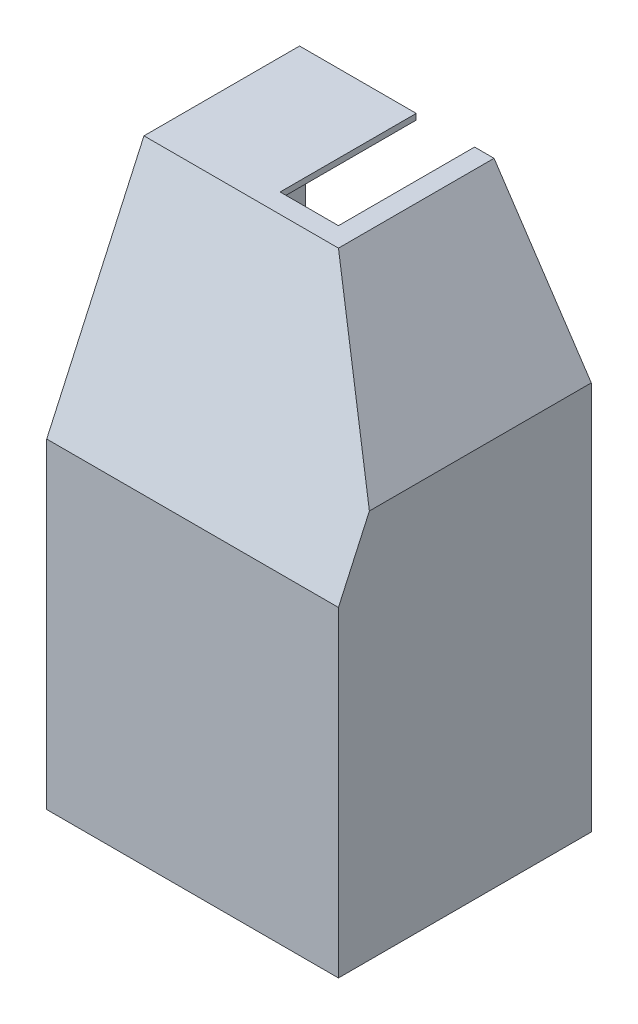
ISO-10303-21;
HEADER;
FILE_DESCRIPTION(('STEP AP214'),'2;1');
FILE_NAME('part.step','',(''),(''),'','','');
FILE_SCHEMA(('AUTOMOTIVE_DESIGN { 1 0 10303 214 1 1 1 1 }'));
ENDSEC;
DATA;
#1=APPLICATION_CONTEXT('core data for automotive mechanical design processes');
#2=APPLICATION_PROTOCOL_DEFINITION('international standard','automotive_design',2000,#1);
#3=PRODUCT_CONTEXT('',#1,'mechanical');
#4=PRODUCT('Part','Part','',(#3));
#5=PRODUCT_RELATED_PRODUCT_CATEGORY('part','',(#4));
#6=PRODUCT_DEFINITION_FORMATION('','',#4);
#7=PRODUCT_DEFINITION_CONTEXT('part definition',#1,'design');
#8=PRODUCT_DEFINITION('design','',#6,#7);
#9=PRODUCT_DEFINITION_SHAPE('','',#8);
#10=(LENGTH_UNIT() NAMED_UNIT(*) SI_UNIT(.MILLI.,.METRE.));
#11=(NAMED_UNIT(*) PLANE_ANGLE_UNIT() SI_UNIT($,.RADIAN.));
#12=(NAMED_UNIT(*) SI_UNIT($,.STERADIAN.) SOLID_ANGLE_UNIT());
#13=UNCERTAINTY_MEASURE_WITH_UNIT(LENGTH_MEASURE(1.E-05),#10,'distance_accuracy_value','');
#14=(GEOMETRIC_REPRESENTATION_CONTEXT(3) GLOBAL_UNCERTAINTY_ASSIGNED_CONTEXT((#13)) GLOBAL_UNIT_ASSIGNED_CONTEXT((#10,
#11,#12)) REPRESENTATION_CONTEXT('',''));
#15=CARTESIAN_POINT('',(0.,0.,0.));
#16=DIRECTION('',(0.,0.,1.));
#17=DIRECTION('',(1.,0.,0.));
#18=AXIS2_PLACEMENT_3D('',#15,#16,#17);
#19=CARTESIAN_POINT('',(75.,5.,130.));
#20=DIRECTION('',(-1.,0.,0.));
#21=DIRECTION('',(0.,0.,1.));
#22=AXIS2_PLACEMENT_3D('',#19,#20,#21);
#23=PLANE('',#22);
#24=DIRECTION('',(0.,0.,-1.));
#25=VECTOR('',#24,1.);
#26=CARTESIAN_POINT('',(75.,205.,130.));
#27=LINE('',#26,#25);
#28=CARTESIAN_POINT('',(75.,205.,114.090909090909));
#29=VERTEX_POINT('',#28);
#30=CARTESIAN_POINT('',(75.,205.,0.));
#31=VERTEX_POINT('',#30);
#32=EDGE_CURVE('E221',#29,#31,#27,.T.);
#33=ORIENTED_EDGE('',*,*,#32,.F.);
#34=DIRECTION('',(0.,-0.910366477462606,0.413802944301182));
#35=VECTOR('',#34,1.);
#36=CARTESIAN_POINT('',(75.,169.999999999999,130.));
#37=LINE('',#36,#35);
#38=CARTESIAN_POINT('',(75.,169.999999999999,130.));
#39=VERTEX_POINT('',#38);
#40=EDGE_CURVE('E11',#29,#39,#37,.T.);
#41=ORIENTED_EDGE('',*,*,#40,.T.);
#42=DIRECTION('',(0.,1.,0.));
#43=VECTOR('',#42,1.);
#44=CARTESIAN_POINT('',(75.,5.,130.));
#45=LINE('',#44,#43);
#46=CARTESIAN_POINT('',(75.,5.,130.));
#47=VERTEX_POINT('',#46);
#48=EDGE_CURVE('E189',#47,#39,#45,.T.);
#49=ORIENTED_EDGE('',*,*,#48,.F.);
#50=DIRECTION('',(0.,0.,-1.));
#51=VECTOR('',#50,1.);
#52=CARTESIAN_POINT('',(75.,5.,130.));
#53=LINE('',#52,#51);
#54=CARTESIAN_POINT('',(75.,5.,0.));
#55=VERTEX_POINT('',#54);
#56=EDGE_CURVE('E197',#47,#55,#53,.T.);
#57=ORIENTED_EDGE('',*,*,#56,.T.);
#58=DIRECTION('',(0.,1.,0.));
#59=VECTOR('',#58,1.);
#60=CARTESIAN_POINT('',(75.,5.,0.));
#61=LINE('',#60,#59);
#62=EDGE_CURVE('E198',#55,#31,#61,.T.);
#63=ORIENTED_EDGE('',*,*,#62,.T.);
#64=EDGE_LOOP('',(#33,#41,#49,#57,#63));
#65=FACE_BOUND('',#64,.T.);
#66=ADVANCED_FACE('F41',(#65),#23,.F.);
#67=CARTESIAN_POINT('',(75.,205.,130.));
#68=DIRECTION('',(-0.832050294337844,-0.554700196225229,0.));
#69=DIRECTION('',(0.554700196225229,-0.832050294337844,0.));
#70=AXIS2_PLACEMENT_3D('',#67,#68,#69);
#71=PLANE('',#70);
#72=DIRECTION('',(0.,0.,-1.));
#73=VECTOR('',#72,1.);
#74=CARTESIAN_POINT('',(24.9999999999999,280.,130.));
#75=LINE('',#74,#73);
#76=CARTESIAN_POINT('',(24.9999999999999,280.,79.9999999999999));
#77=VERTEX_POINT('',#76);
#78=CARTESIAN_POINT('',(24.9999999999999,280.,0.));
#79=VERTEX_POINT('',#78);
#80=EDGE_CURVE('E219',#77,#79,#75,.T.);
#81=ORIENTED_EDGE('',*,*,#80,.F.);
#82=DIRECTION('',(0.518833293700236,-0.778249940550355,0.353749972977432));
#83=VECTOR('',#82,1.);
#84=CARTESIAN_POINT('',(71.8631813125698,209.705228031145,111.952169076752));
#85=LINE('',#84,#83);
#86=EDGE_CURVE('E50',#77,#29,#85,.T.);
#87=ORIENTED_EDGE('',*,*,#86,.T.);
#88=ORIENTED_EDGE('',*,*,#32,.T.);
#89=DIRECTION('',(-0.554700196225229,0.832050294337844,0.));
#90=VECTOR('',#89,1.);
#91=CARTESIAN_POINT('',(75.,205.,0.));
#92=LINE('',#91,#90);
#93=EDGE_CURVE('E201',#31,#79,#92,.T.);
#94=ORIENTED_EDGE('',*,*,#93,.T.);
#95=EDGE_LOOP('',(#81,#87,#88,#94));
#96=FACE_BOUND('',#95,.T.);
#97=ADVANCED_FACE('F233',(#96),#71,.F.);
#98=CARTESIAN_POINT('',(24.9999999999999,280.,130.));
#99=DIRECTION('',(0.,-1.,0.));
#100=DIRECTION('',(0.,0.,-1.));
#101=AXIS2_PLACEMENT_3D('',#98,#99,#100);
#102=PLANE('',#101);
#103=DIRECTION('',(-1.,0.,0.));
#104=VECTOR('',#103,1.);
#105=CARTESIAN_POINT('',(24.9999999999999,280.,0.));
#106=LINE('',#105,#104);
#107=CARTESIAN_POINT('',(14.9999999999999,280.,0.));
#108=VERTEX_POINT('',#107);
#109=EDGE_CURVE('E205',#79,#108,#106,.T.);
#110=ORIENTED_EDGE('',*,*,#109,.T.);
#111=DIRECTION('',(0.,0.,-1.));
#112=VECTOR('',#111,1.);
#113=CARTESIAN_POINT('',(14.9999999999999,280.,0.));
#114=LINE('',#113,#112);
#115=CARTESIAN_POINT('',(14.9999999999999,280.,70.));
#116=VERTEX_POINT('',#115);
#117=EDGE_CURVE('E163',#116,#108,#114,.T.);
#118=ORIENTED_EDGE('',*,*,#117,.F.);
#119=DIRECTION('',(1.,0.,0.));
#120=VECTOR('',#119,1.);
#121=CARTESIAN_POINT('',(14.9999999999999,280.,70.));
#122=LINE('',#121,#120);
#123=CARTESIAN_POINT('',(-15.0000000000001,280.,70.));
#124=VERTEX_POINT('',#123);
#125=EDGE_CURVE('E263',#124,#116,#122,.T.);
#126=ORIENTED_EDGE('',*,*,#125,.F.);
#127=DIRECTION('',(0.,0.,1.));
#128=VECTOR('',#127,1.);
#129=CARTESIAN_POINT('',(-15.0000000000001,280.,70.));
#130=LINE('',#129,#128);
#131=CARTESIAN_POINT('',(-15.,280.,0.));
#132=VERTEX_POINT('',#131);
#133=EDGE_CURVE('E261',#132,#124,#130,.T.);
#134=ORIENTED_EDGE('',*,*,#133,.F.);
#135=CARTESIAN_POINT('',(-75.0000000000001,280.,0.));
#136=VERTEX_POINT('',#135);
#137=EDGE_CURVE('E172',#132,#136,#106,.T.);
#138=ORIENTED_EDGE('',*,*,#137,.T.);
#139=DIRECTION('',(0.,0.,-1.));
#140=VECTOR('',#139,1.);
#141=CARTESIAN_POINT('',(-75.0000000000001,280.,130.));
#142=LINE('',#141,#140);
#143=CARTESIAN_POINT('',(-75.0000000000001,280.,79.9999999999999));
#144=VERTEX_POINT('',#143);
#145=EDGE_CURVE('E216',#144,#136,#142,.T.);
#146=ORIENTED_EDGE('',*,*,#145,.F.);
#147=DIRECTION('',(1.,0.,0.));
#148=VECTOR('',#147,1.);
#149=CARTESIAN_POINT('',(24.9999999999999,280.,79.9999999999999));
#150=LINE('',#149,#148);
#151=EDGE_CURVE('E228',#144,#77,#150,.T.);
#152=ORIENTED_EDGE('',*,*,#151,.T.);
#153=ORIENTED_EDGE('',*,*,#80,.T.);
#154=EDGE_LOOP('',(#110,#118,#126,#134,#138,#146,#152,#153));
#155=FACE_BOUND('',#154,.T.);
#156=ADVANCED_FACE('F259',(#155),#102,.F.);
#157=CARTESIAN_POINT('',(-75.0000000000001,280.,130.));
#158=DIRECTION('',(1.,0.,0.));
#159=DIRECTION('',(0.,1.,0.));
#160=AXIS2_PLACEMENT_3D('',#157,#158,#159);
#161=PLANE('',#160);
#162=DIRECTION('',(0.,-1.,0.));
#163=VECTOR('',#162,1.);
#164=CARTESIAN_POINT('',(-75.0000000000001,280.,130.));
#165=LINE('',#164,#163);
#166=CARTESIAN_POINT('',(-75.0000000000001,169.999999999999,130.));
#167=VERTEX_POINT('',#166);
#168=CARTESIAN_POINT('',(-75.,5.,130.));
#169=VERTEX_POINT('',#168);
#170=EDGE_CURVE('E192',#167,#169,#165,.T.);
#171=ORIENTED_EDGE('',*,*,#170,.F.);
#172=DIRECTION('',(0.,0.910366477462606,-0.413802944301182));
#173=VECTOR('',#172,1.);
#174=CARTESIAN_POINT('',(-75.0000000000001,169.999999999999,130.));
#175=LINE('',#174,#173);
#176=EDGE_CURVE('E226',#167,#144,#175,.T.);
#177=ORIENTED_EDGE('',*,*,#176,.T.);
#178=ORIENTED_EDGE('',*,*,#145,.T.);
#179=DIRECTION('',(0.,-1.,0.));
#180=VECTOR('',#179,1.);
#181=CARTESIAN_POINT('',(-75.0000000000001,280.,0.));
#182=LINE('',#181,#180);
#183=CARTESIAN_POINT('',(-75.,5.,0.));
#184=VERTEX_POINT('',#183);
#185=EDGE_CURVE('E208',#136,#184,#182,.T.);
#186=ORIENTED_EDGE('',*,*,#185,.T.);
#187=DIRECTION('',(0.,0.,-1.));
#188=VECTOR('',#187,1.);
#189=CARTESIAN_POINT('',(-75.,5.,130.));
#190=LINE('',#189,#188);
#191=EDGE_CURVE('E213',#169,#184,#190,.T.);
#192=ORIENTED_EDGE('',*,*,#191,.F.);
#193=EDGE_LOOP('',(#171,#177,#178,#186,#192));
#194=FACE_BOUND('',#193,.T.);
#195=ADVANCED_FACE('F247',(#194),#161,.F.);
#196=CARTESIAN_POINT('',(-75.,5.,130.));
#197=DIRECTION('',(0.,1.,0.));
#198=DIRECTION('',(-1.,0.,0.));
#199=AXIS2_PLACEMENT_3D('',#196,#197,#198);
#200=PLANE('',#199);
#201=DIRECTION('',(1.,0.,0.));
#202=VECTOR('',#201,1.);
#203=CARTESIAN_POINT('',(-75.,5.,0.));
#204=LINE('',#203,#202);
#205=EDGE_CURVE('E193',#184,#55,#204,.T.);
#206=ORIENTED_EDGE('',*,*,#205,.T.);
#207=ORIENTED_EDGE('',*,*,#56,.F.);
#208=DIRECTION('',(1.,0.,0.));
#209=VECTOR('',#208,1.);
#210=CARTESIAN_POINT('',(-75.,5.,130.));
#211=LINE('',#210,#209);
#212=EDGE_CURVE('E195',#169,#47,#211,.T.);
#213=ORIENTED_EDGE('',*,*,#212,.F.);
#214=ORIENTED_EDGE('',*,*,#191,.T.);
#215=EDGE_LOOP('',(#206,#207,#213,#214));
#216=FACE_BOUND('',#215,.T.);
#217=ADVANCED_FACE('F253',(#216),#200,.F.);
#218=CARTESIAN_POINT('',(0.,0.,130.));
#219=DIRECTION('',(0.,0.,1.));
#220=DIRECTION('',(1.,0.,0.));
#221=AXIS2_PLACEMENT_3D('',#218,#219,#220);
#222=PLANE('',#221);
#223=ORIENTED_EDGE('',*,*,#48,.T.);
#224=DIRECTION('',(-1.,0.,0.));
#225=VECTOR('',#224,1.);
#226=CARTESIAN_POINT('',(-75.0000000000001,169.999999999999,130.));
#227=LINE('',#226,#225);
#228=EDGE_CURVE('E223',#39,#167,#227,.T.);
#229=ORIENTED_EDGE('',*,*,#228,.T.);
#230=ORIENTED_EDGE('',*,*,#170,.T.);
#231=ORIENTED_EDGE('',*,*,#212,.T.);
#232=EDGE_LOOP('',(#223,#229,#230,#231));
#233=FACE_BOUND('',#232,.T.);
#234=ADVANCED_FACE('F244',(#233),#222,.T.);
#235=CARTESIAN_POINT('',(0.,0.,0.));
#236=DIRECTION('',(0.,0.,1.));
#237=DIRECTION('',(1.,0.,0.));
#238=AXIS2_PLACEMENT_3D('',#235,#236,#237);
#239=PLANE('',#238);
#240=DIRECTION('',(-1.,0.,0.));
#241=VECTOR('',#240,1.);
#242=CARTESIAN_POINT('',(24.9999999999999,277.,0.));
#243=LINE('',#242,#241);
#244=CARTESIAN_POINT('',(23.3944487245359,277.,0.));
#245=VERTEX_POINT('',#244);
#246=CARTESIAN_POINT('',(14.9999999999999,277.,0.));
#247=VERTEX_POINT('',#246);
#248=EDGE_CURVE('E65',#245,#247,#243,.T.);
#249=ORIENTED_EDGE('',*,*,#248,.T.);
#250=DIRECTION('',(0.,1.,0.));
#251=VECTOR('',#250,1.);
#252=CARTESIAN_POINT('',(14.9999999999999,277.,0.));
#253=LINE('',#252,#251);
#254=EDGE_CURVE('E256',#247,#108,#253,.T.);
#255=ORIENTED_EDGE('',*,*,#254,.T.);
#256=ORIENTED_EDGE('',*,*,#109,.F.);
#257=ORIENTED_EDGE('',*,*,#93,.F.);
#258=ORIENTED_EDGE('',*,*,#62,.F.);
#259=ORIENTED_EDGE('',*,*,#205,.F.);
#260=ORIENTED_EDGE('',*,*,#185,.F.);
#261=ORIENTED_EDGE('',*,*,#137,.F.);
#262=DIRECTION('',(0.,1.,0.));
#263=VECTOR('',#262,1.);
#264=CARTESIAN_POINT('',(-15.,277.,0.));
#265=LINE('',#264,#263);
#266=CARTESIAN_POINT('',(-15.,277.,0.));
#267=VERTEX_POINT('',#266);
#268=EDGE_CURVE('E159',#267,#132,#265,.T.);
#269=ORIENTED_EDGE('',*,*,#268,.F.);
#270=CARTESIAN_POINT('',(-72.0000000000001,277.,0.));
#271=VERTEX_POINT('',#270);
#272=EDGE_CURVE('E169',#267,#271,#243,.T.);
#273=ORIENTED_EDGE('',*,*,#272,.T.);
#274=DIRECTION('',(0.,-1.,0.));
#275=VECTOR('',#274,1.);
#276=CARTESIAN_POINT('',(-72.0000000000001,280.,0.));
#277=LINE('',#276,#275);
#278=CARTESIAN_POINT('',(-72.,8.,0.));
#279=VERTEX_POINT('',#278);
#280=EDGE_CURVE('E182',#271,#279,#277,.T.);
#281=ORIENTED_EDGE('',*,*,#280,.T.);
#282=DIRECTION('',(1.,0.,0.));
#283=VECTOR('',#282,1.);
#284=CARTESIAN_POINT('',(-75.,8.,0.));
#285=LINE('',#284,#283);
#286=CARTESIAN_POINT('',(72.,8.,0.));
#287=VERTEX_POINT('',#286);
#288=EDGE_CURVE('E284',#279,#287,#285,.T.);
#289=ORIENTED_EDGE('',*,*,#288,.T.);
#290=DIRECTION('',(0.,1.,0.));
#291=VECTOR('',#290,1.);
#292=CARTESIAN_POINT('',(72.,5.,0.));
#293=LINE('',#292,#291);
#294=CARTESIAN_POINT('',(72.,204.091673086804,0.));
#295=VERTEX_POINT('',#294);
#296=EDGE_CURVE('E184',#287,#295,#293,.T.);
#297=ORIENTED_EDGE('',*,*,#296,.T.);
#298=DIRECTION('',(-0.554700196225229,0.832050294337844,0.));
#299=VECTOR('',#298,1.);
#300=CARTESIAN_POINT('',(72.5038491169864,203.335899411324,0.));
#301=LINE('',#300,#299);
#302=EDGE_CURVE('E180',#295,#245,#301,.T.);
#303=ORIENTED_EDGE('',*,*,#302,.T.);
#304=EDGE_LOOP('',(#249,#255,#256,#257,#258,#259,#260,#261,#269,#273,#281,#289,#297,#303));
#305=FACE_BOUND('',#304,.T.);
#306=ADVANCED_FACE('F167',(#305),#239,.F.);
#307=CARTESIAN_POINT('',(0.,169.999999999999,130.));
#308=DIRECTION('',(0.,0.413802944301182,0.910366477462606));
#309=DIRECTION('',(1.,0.,0.));
#310=AXIS2_PLACEMENT_3D('',#307,#308,#309);
#311=PLANE('',#310);
#312=ORIENTED_EDGE('',*,*,#86,.F.);
#313=ORIENTED_EDGE('',*,*,#151,.F.);
#314=ORIENTED_EDGE('',*,*,#176,.F.);
#315=ORIENTED_EDGE('',*,*,#228,.F.);
#316=ORIENTED_EDGE('',*,*,#40,.F.);
#317=EDGE_LOOP('',(#312,#313,#314,#315,#316));
#318=FACE_BOUND('',#317,.T.);
#319=ADVANCED_FACE('F44',(#318),#311,.T.);
#320=CARTESIAN_POINT('',(72.,5.,130.));
#321=DIRECTION('',(-1.,0.,0.));
#322=DIRECTION('',(0.,0.,1.));
#323=AXIS2_PLACEMENT_3D('',#320,#321,#322);
#324=PLANE('',#323);
#325=DIRECTION('',(0.,0.,-1.));
#326=VECTOR('',#325,1.);
#327=CARTESIAN_POINT('',(72.,204.091673086804,130.));
#328=LINE('',#327,#326);
#329=CARTESIAN_POINT('',(72.,204.091673086804,111.208408785927));
#330=VERTEX_POINT('',#329);
#331=EDGE_CURVE('E274',#330,#295,#328,.T.);
#332=ORIENTED_EDGE('',*,*,#331,.T.);
#333=ORIENTED_EDGE('',*,*,#296,.F.);
#334=DIRECTION('',(0.,0.,-1.));
#335=VECTOR('',#334,1.);
#336=CARTESIAN_POINT('',(72.,8.,130.));
#337=LINE('',#336,#335);
#338=CARTESIAN_POINT('',(72.,8.,127.));
#339=VERTEX_POINT('',#338);
#340=EDGE_CURVE('E285',#339,#287,#337,.T.);
#341=ORIENTED_EDGE('',*,*,#340,.F.);
#342=DIRECTION('',(0.,1.,0.));
#343=VECTOR('',#342,1.);
#344=CARTESIAN_POINT('',(72.,5.,127.));
#345=LINE('',#344,#343);
#346=CARTESIAN_POINT('',(72.,169.350172415842,127.));
#347=VERTEX_POINT('',#346);
#348=EDGE_CURVE('E280',#339,#347,#345,.T.);
#349=ORIENTED_EDGE('',*,*,#348,.T.);
#350=DIRECTION('',(0.,-0.910366477462606,0.413802944301182));
#351=VECTOR('',#350,1.);
#352=CARTESIAN_POINT('',(72.,168.758591167096,127.268900567612));
#353=LINE('',#352,#351);
#354=EDGE_CURVE('E202',#330,#347,#353,.T.);
#355=ORIENTED_EDGE('',*,*,#354,.F.);
#356=EDGE_LOOP('',(#332,#333,#341,#349,#355));
#357=FACE_BOUND('',#356,.T.);
#358=ADVANCED_FACE('F315',(#357),#324,.T.);
#359=CARTESIAN_POINT('',(72.5038491169864,203.335899411324,130.));
#360=DIRECTION('',(-0.832050294337844,-0.554700196225229,0.));
#361=DIRECTION('',(0.554700196225229,-0.832050294337844,0.));
#362=AXIS2_PLACEMENT_3D('',#359,#360,#361);
#363=PLANE('',#362);
#364=DIRECTION('',(0.,0.,-1.));
#365=VECTOR('',#364,1.);
#366=CARTESIAN_POINT('',(23.394448724536,277.,130.));
#367=LINE('',#366,#365);
#368=CARTESIAN_POINT('',(23.3944487245359,277.,78.0682601890196));
#369=VERTEX_POINT('',#368);
#370=EDGE_CURVE('E277',#369,#245,#367,.T.);
#371=ORIENTED_EDGE('',*,*,#370,.T.);
#372=ORIENTED_EDGE('',*,*,#302,.F.);
#373=ORIENTED_EDGE('',*,*,#331,.F.);
#374=DIRECTION('',(0.518833293700236,-0.778249940550355,0.353749972977432));
#375=VECTOR('',#374,1.);
#376=CARTESIAN_POINT('',(69.8330254514263,207.342134909664,109.730926139172));
#377=LINE('',#376,#375);
#378=EDGE_CURVE('E279',#369,#330,#377,.T.);
#379=ORIENTED_EDGE('',*,*,#378,.F.);
#380=EDGE_LOOP('',(#371,#372,#373,#379));
#381=FACE_BOUND('',#380,.T.);
#382=ADVANCED_FACE('F320',(#381),#363,.T.);
#383=CARTESIAN_POINT('',(24.9999999999999,277.,130.));
#384=DIRECTION('',(0.,-1.,0.));
#385=DIRECTION('',(0.,0.,-1.));
#386=AXIS2_PLACEMENT_3D('',#383,#384,#385);
#387=PLANE('',#386);
#388=DIRECTION('',(0.,0.,-1.));
#389=VECTOR('',#388,1.);
#390=CARTESIAN_POINT('',(14.9999999999999,277.,0.));
#391=LINE('',#390,#389);
#392=CARTESIAN_POINT('',(14.9999999999999,277.,70.));
#393=VERTEX_POINT('',#392);
#394=EDGE_CURVE('E173',#393,#247,#391,.T.);
#395=ORIENTED_EDGE('',*,*,#394,.T.);
#396=ORIENTED_EDGE('',*,*,#248,.F.);
#397=ORIENTED_EDGE('',*,*,#370,.F.);
#398=DIRECTION('',(1.,0.,0.));
#399=VECTOR('',#398,1.);
#400=CARTESIAN_POINT('',(0.,277.,78.0682601890196));
#401=LINE('',#400,#399);
#402=CARTESIAN_POINT('',(-72.0000000000001,277.,78.0682601890196));
#403=VERTEX_POINT('',#402);
#404=EDGE_CURVE('E291',#403,#369,#401,.T.);
#405=ORIENTED_EDGE('',*,*,#404,.F.);
#406=DIRECTION('',(0.,0.,-1.));
#407=VECTOR('',#406,1.);
#408=CARTESIAN_POINT('',(-72.0000000000001,277.,130.));
#409=LINE('',#408,#407);
#410=EDGE_CURVE('E178',#403,#271,#409,.T.);
#411=ORIENTED_EDGE('',*,*,#410,.T.);
#412=ORIENTED_EDGE('',*,*,#272,.F.);
#413=DIRECTION('',(0.,0.,1.));
#414=VECTOR('',#413,1.);
#415=CARTESIAN_POINT('',(-15.0000000000001,277.,70.));
#416=LINE('',#415,#414);
#417=CARTESIAN_POINT('',(-15.0000000000001,277.,70.));
#418=VERTEX_POINT('',#417);
#419=EDGE_CURVE('E155',#267,#418,#416,.T.);
#420=ORIENTED_EDGE('',*,*,#419,.T.);
#421=DIRECTION('',(1.,0.,0.));
#422=VECTOR('',#421,1.);
#423=CARTESIAN_POINT('',(14.9999999999999,277.,70.));
#424=LINE('',#423,#422);
#425=EDGE_CURVE('E57',#418,#393,#424,.T.);
#426=ORIENTED_EDGE('',*,*,#425,.T.);
#427=EDGE_LOOP('',(#395,#396,#397,#405,#411,#412,#420,#426));
#428=FACE_BOUND('',#427,.T.);
#429=ADVANCED_FACE('F175',(#428),#387,.T.);
#430=CARTESIAN_POINT('',(-72.0000000000001,280.,130.));
#431=DIRECTION('',(1.,0.,0.));
#432=DIRECTION('',(0.,1.,0.));
#433=AXIS2_PLACEMENT_3D('',#430,#431,#432);
#434=PLANE('',#433);
#435=DIRECTION('',(0.,-1.,0.));
#436=VECTOR('',#435,1.);
#437=CARTESIAN_POINT('',(-72.0000000000001,280.,127.));
#438=LINE('',#437,#436);
#439=CARTESIAN_POINT('',(-72.0000000000001,169.350172415842,127.));
#440=VERTEX_POINT('',#439);
#441=CARTESIAN_POINT('',(-72.,8.,127.));
#442=VERTEX_POINT('',#441);
#443=EDGE_CURVE('E283',#440,#442,#438,.T.);
#444=ORIENTED_EDGE('',*,*,#443,.T.);
#445=DIRECTION('',(0.,0.,-1.));
#446=VECTOR('',#445,1.);
#447=CARTESIAN_POINT('',(-72.,8.,130.));
#448=LINE('',#447,#446);
#449=EDGE_CURVE('E287',#442,#279,#448,.T.);
#450=ORIENTED_EDGE('',*,*,#449,.T.);
#451=ORIENTED_EDGE('',*,*,#280,.F.);
#452=ORIENTED_EDGE('',*,*,#410,.F.);
#453=DIRECTION('',(0.,0.910366477462606,-0.413802944301182));
#454=VECTOR('',#453,1.);
#455=CARTESIAN_POINT('',(-72.0000000000001,168.758591167096,127.268900567612));
#456=LINE('',#455,#454);
#457=EDGE_CURVE('E294',#440,#403,#456,.T.);
#458=ORIENTED_EDGE('',*,*,#457,.F.);
#459=EDGE_LOOP('',(#444,#450,#451,#452,#458));
#460=FACE_BOUND('',#459,.T.);
#461=ADVANCED_FACE('F305',(#460),#434,.T.);
#462=CARTESIAN_POINT('',(-75.,8.,130.));
#463=DIRECTION('',(0.,1.,0.));
#464=DIRECTION('',(-1.,0.,0.));
#465=AXIS2_PLACEMENT_3D('',#462,#463,#464);
#466=PLANE('',#465);
#467=ORIENTED_EDGE('',*,*,#288,.F.);
#468=ORIENTED_EDGE('',*,*,#449,.F.);
#469=DIRECTION('',(1.,0.,0.));
#470=VECTOR('',#469,1.);
#471=CARTESIAN_POINT('',(-75.,8.,127.));
#472=LINE('',#471,#470);
#473=EDGE_CURVE('E288',#442,#339,#472,.T.);
#474=ORIENTED_EDGE('',*,*,#473,.T.);
#475=ORIENTED_EDGE('',*,*,#340,.T.);
#476=EDGE_LOOP('',(#467,#468,#474,#475));
#477=FACE_BOUND('',#476,.T.);
#478=ADVANCED_FACE('F310',(#477),#466,.T.);
#479=CARTESIAN_POINT('',(0.,0.,127.));
#480=DIRECTION('',(0.,0.,1.));
#481=DIRECTION('',(1.,0.,0.));
#482=AXIS2_PLACEMENT_3D('',#479,#480,#481);
#483=PLANE('',#482);
#484=ORIENTED_EDGE('',*,*,#348,.F.);
#485=ORIENTED_EDGE('',*,*,#473,.F.);
#486=ORIENTED_EDGE('',*,*,#443,.F.);
#487=DIRECTION('',(-1.,0.,0.));
#488=VECTOR('',#487,1.);
#489=CARTESIAN_POINT('',(0.,169.350172415842,127.));
#490=LINE('',#489,#488);
#491=EDGE_CURVE('E276',#347,#440,#490,.T.);
#492=ORIENTED_EDGE('',*,*,#491,.F.);
#493=EDGE_LOOP('',(#484,#485,#486,#492));
#494=FACE_BOUND('',#493,.T.);
#495=ADVANCED_FACE('F326',(#494),#483,.F.);
#496=CARTESIAN_POINT('',(0.,168.758591167096,127.268900567612));
#497=DIRECTION('',(0.,0.413802944301182,0.910366477462606));
#498=DIRECTION('',(1.,0.,0.));
#499=AXIS2_PLACEMENT_3D('',#496,#497,#498);
#500=PLANE('',#499);
#501=ORIENTED_EDGE('',*,*,#378,.T.);
#502=ORIENTED_EDGE('',*,*,#354,.T.);
#503=ORIENTED_EDGE('',*,*,#491,.T.);
#504=ORIENTED_EDGE('',*,*,#457,.T.);
#505=ORIENTED_EDGE('',*,*,#404,.T.);
#506=EDGE_LOOP('',(#501,#502,#503,#504,#505));
#507=FACE_BOUND('',#506,.T.);
#508=ADVANCED_FACE('F323',(#507),#500,.F.);
#509=CARTESIAN_POINT('',(14.9999999999999,277.,0.));
#510=DIRECTION('',(1.,0.,0.));
#511=DIRECTION('',(0.,0.,-1.));
#512=AXIS2_PLACEMENT_3D('',#509,#510,#511);
#513=PLANE('',#512);
#514=ORIENTED_EDGE('',*,*,#117,.T.);
#515=ORIENTED_EDGE('',*,*,#254,.F.);
#516=ORIENTED_EDGE('',*,*,#394,.F.);
#517=DIRECTION('',(0.,1.,0.));
#518=VECTOR('',#517,1.);
#519=CARTESIAN_POINT('',(14.9999999999999,277.,70.));
#520=LINE('',#519,#518);
#521=EDGE_CURVE('E271',#393,#116,#520,.T.);
#522=ORIENTED_EDGE('',*,*,#521,.T.);
#523=EDGE_LOOP('',(#514,#515,#516,#522));
#524=FACE_BOUND('',#523,.T.);
#525=ADVANCED_FACE('F333',(#524),#513,.F.);
#526=CARTESIAN_POINT('',(14.9999999999999,277.,70.));
#527=DIRECTION('',(0.,0.,1.));
#528=DIRECTION('',(1.,0.,0.));
#529=AXIS2_PLACEMENT_3D('',#526,#527,#528);
#530=PLANE('',#529);
#531=ORIENTED_EDGE('',*,*,#125,.T.);
#532=ORIENTED_EDGE('',*,*,#521,.F.);
#533=ORIENTED_EDGE('',*,*,#425,.F.);
#534=DIRECTION('',(0.,1.,0.));
#535=VECTOR('',#534,1.);
#536=CARTESIAN_POINT('',(-15.0000000000001,277.,70.));
#537=LINE('',#536,#535);
#538=EDGE_CURVE('E161',#418,#124,#537,.T.);
#539=ORIENTED_EDGE('',*,*,#538,.T.);
#540=EDGE_LOOP('',(#531,#532,#533,#539));
#541=FACE_BOUND('',#540,.T.);
#542=ADVANCED_FACE('F478',(#541),#530,.F.);
#543=CARTESIAN_POINT('',(-15.0000000000001,277.,70.));
#544=DIRECTION('',(-1.,0.,0.));
#545=DIRECTION('',(0.,0.,1.));
#546=AXIS2_PLACEMENT_3D('',#543,#544,#545);
#547=PLANE('',#546);
#548=ORIENTED_EDGE('',*,*,#133,.T.);
#549=ORIENTED_EDGE('',*,*,#538,.F.);
#550=ORIENTED_EDGE('',*,*,#419,.F.);
#551=ORIENTED_EDGE('',*,*,#268,.T.);
#552=EDGE_LOOP('',(#548,#549,#550,#551));
#553=FACE_BOUND('',#552,.T.);
#554=ADVANCED_FACE('F158',(#553),#547,.F.);
#555=CLOSED_SHELL('',(#66,#97,#156,#195,#217,#234,#306,#319,#358,#382,#429,#461,#478,#495,#508,
#525,#542,#554));
#556=MANIFOLD_SOLID_BREP('B2',#555);
#557=ADVANCED_BREP_SHAPE_REPRESENTATION('',(#18,#556),#14);
#558=SHAPE_DEFINITION_REPRESENTATION(#9,#557);
ENDSEC;
END-ISO-10303-21;
